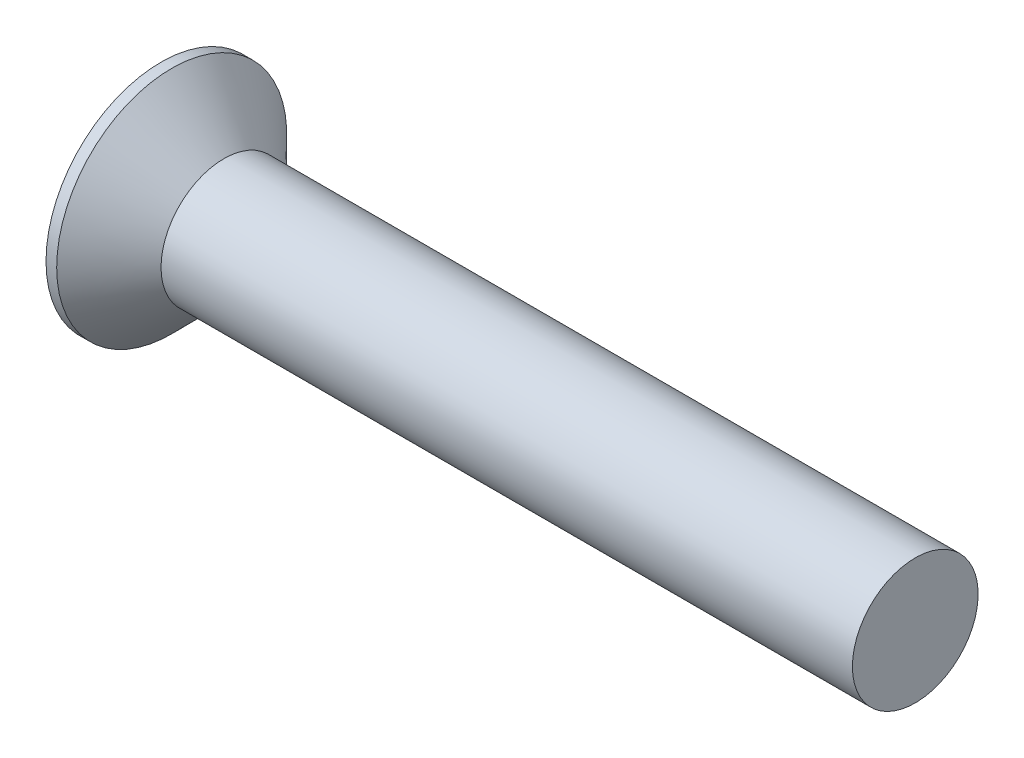
ISO-10303-21;
HEADER;
FILE_DESCRIPTION(('STEP AP214'),'2;1');
FILE_NAME('part.step','',(''),(''),'','','');
FILE_SCHEMA(('AUTOMOTIVE_DESIGN { 1 0 10303 214 1 1 1 1 }'));
ENDSEC;
DATA;
#1=APPLICATION_CONTEXT('core data for automotive mechanical design processes');
#2=APPLICATION_PROTOCOL_DEFINITION('international standard','automotive_design',2000,#1);
#3=PRODUCT_CONTEXT('',#1,'mechanical');
#4=PRODUCT('Part','Part','',(#3));
#5=PRODUCT_RELATED_PRODUCT_CATEGORY('part','',(#4));
#6=PRODUCT_DEFINITION_FORMATION('','',#4);
#7=PRODUCT_DEFINITION_CONTEXT('part definition',#1,'design');
#8=PRODUCT_DEFINITION('design','',#6,#7);
#9=PRODUCT_DEFINITION_SHAPE('','',#8);
#10=(LENGTH_UNIT() NAMED_UNIT(*) SI_UNIT(.MILLI.,.METRE.));
#11=(NAMED_UNIT(*) PLANE_ANGLE_UNIT() SI_UNIT($,.RADIAN.));
#12=(NAMED_UNIT(*) SI_UNIT($,.STERADIAN.) SOLID_ANGLE_UNIT());
#13=UNCERTAINTY_MEASURE_WITH_UNIT(LENGTH_MEASURE(1.E-05),#10,'distance_accuracy_value','');
#14=(GEOMETRIC_REPRESENTATION_CONTEXT(3) GLOBAL_UNCERTAINTY_ASSIGNED_CONTEXT((#13)) GLOBAL_UNIT_ASSIGNED_CONTEXT((#10,
#11,#12)) REPRESENTATION_CONTEXT('',''));
#15=CARTESIAN_POINT('',(0.,0.,0.));
#16=DIRECTION('',(0.,0.,1.));
#17=DIRECTION('',(1.,0.,0.));
#18=AXIS2_PLACEMENT_3D('',#15,#16,#17);
#19=CARTESIAN_POINT('',(0.,0.,0.));
#20=DIRECTION('',(-1.,0.,0.));
#21=DIRECTION('',(0.,0.,1.));
#22=AXIS2_PLACEMENT_3D('',#19,#20,#21);
#23=PLANE('',#22);
#24=CARTESIAN_POINT('',(0.,0.,0.));
#25=DIRECTION('',(-1.,0.,0.));
#26=DIRECTION('',(0.,0.,1.));
#27=AXIS2_PLACEMENT_3D('',#24,#25,#26);
#28=CIRCLE('',#27,9.15);
#29=CARTESIAN_POINT('',(0.,0.,9.15));
#30=VERTEX_POINT('',#29);
#31=EDGE_CURVE('E44',#30,#30,#28,.T.);
#32=ORIENTED_EDGE('',*,*,#31,.T.);
#33=EDGE_LOOP('',(#32));
#34=FACE_BOUND('',#33,.T.);
#35=DIRECTION('',(0.,1.,0.));
#36=VECTOR('',#35,1.);
#37=CARTESIAN_POINT('',(0.,-4.94,-0.99));
#38=LINE('',#37,#36);
#39=CARTESIAN_POINT('',(0.,-4.94,-0.99));
#40=VERTEX_POINT('',#39);
#41=CARTESIAN_POINT('',(0.,-0.989999999999997,-0.989999999999999));
#42=VERTEX_POINT('',#41);
#43=EDGE_CURVE('E105',#40,#42,#38,.T.);
#44=ORIENTED_EDGE('',*,*,#43,.T.);
#45=DIRECTION('',(0.,0.,-1.));
#46=VECTOR('',#45,1.);
#47=CARTESIAN_POINT('',(0.,-0.990000000000017,4.94));
#48=LINE('',#47,#46);
#49=CARTESIAN_POINT('',(0.,-0.989999999999984,-4.94));
#50=VERTEX_POINT('',#49);
#51=EDGE_CURVE('E85',#42,#50,#48,.T.);
#52=ORIENTED_EDGE('',*,*,#51,.T.);
#53=DIRECTION('',(0.,1.,0.));
#54=VECTOR('',#53,1.);
#55=CARTESIAN_POINT('',(0.,-0.989999999999984,-4.94));
#56=LINE('',#55,#54);
#57=CARTESIAN_POINT('',(0.,0.990000000000017,-4.94));
#58=VERTEX_POINT('',#57);
#59=EDGE_CURVE('E344',#50,#58,#56,.T.);
#60=ORIENTED_EDGE('',*,*,#59,.T.);
#61=DIRECTION('',(0.,0.,1.));
#62=VECTOR('',#61,1.);
#63=CARTESIAN_POINT('',(0.,0.990000000000017,-4.94));
#64=LINE('',#63,#62);
#65=CARTESIAN_POINT('',(0.,0.990000000000003,-0.990000000000001));
#66=VERTEX_POINT('',#65);
#67=EDGE_CURVE('E101',#58,#66,#64,.T.);
#68=ORIENTED_EDGE('',*,*,#67,.T.);
#69=CARTESIAN_POINT('',(0.,4.94,-0.99));
#70=VERTEX_POINT('',#69);
#71=EDGE_CURVE('E95',#66,#70,#38,.T.);
#72=ORIENTED_EDGE('',*,*,#71,.T.);
#73=DIRECTION('',(0.,0.,1.));
#74=VECTOR('',#73,1.);
#75=CARTESIAN_POINT('',(0.,4.94,-0.99));
#76=LINE('',#75,#74);
#77=CARTESIAN_POINT('',(0.,4.94,0.99));
#78=VERTEX_POINT('',#77);
#79=EDGE_CURVE('E98',#70,#78,#76,.T.);
#80=ORIENTED_EDGE('',*,*,#79,.T.);
#81=DIRECTION('',(0.,-1.,0.));
#82=VECTOR('',#81,1.);
#83=CARTESIAN_POINT('',(0.,4.94,0.99));
#84=LINE('',#83,#82);
#85=CARTESIAN_POINT('',(0.,0.989999999999997,0.99));
#86=VERTEX_POINT('',#85);
#87=EDGE_CURVE('E356',#78,#86,#84,.T.);
#88=ORIENTED_EDGE('',*,*,#87,.T.);
#89=CARTESIAN_POINT('',(0.,0.989999999999983,4.94));
#90=VERTEX_POINT('',#89);
#91=EDGE_CURVE('E339',#86,#90,#64,.T.);
#92=ORIENTED_EDGE('',*,*,#91,.T.);
#93=DIRECTION('',(0.,-1.,0.));
#94=VECTOR('',#93,1.);
#95=CARTESIAN_POINT('',(0.,0.989999999999983,4.94));
#96=LINE('',#95,#94);
#97=CARTESIAN_POINT('',(0.,-0.990000000000017,4.94));
#98=VERTEX_POINT('',#97);
#99=EDGE_CURVE('E325',#90,#98,#96,.T.);
#100=ORIENTED_EDGE('',*,*,#99,.T.);
#101=CARTESIAN_POINT('',(0.,-0.990000000000004,0.990000000000001));
#102=VERTEX_POINT('',#101);
#103=EDGE_CURVE('E337',#98,#102,#48,.T.);
#104=ORIENTED_EDGE('',*,*,#103,.T.);
#105=CARTESIAN_POINT('',(0.,-4.94,0.990000000000001));
#106=VERTEX_POINT('',#105);
#107=EDGE_CURVE('E111',#102,#106,#84,.T.);
#108=ORIENTED_EDGE('',*,*,#107,.T.);
#109=DIRECTION('',(0.,0.,-1.));
#110=VECTOR('',#109,1.);
#111=CARTESIAN_POINT('',(0.,-4.94,0.990000000000001));
#112=LINE('',#111,#110);
#113=EDGE_CURVE('E134',#106,#40,#112,.T.);
#114=ORIENTED_EDGE('',*,*,#113,.T.);
#115=EDGE_LOOP('',(#44,#52,#60,#68,#72,#80,#88,#92,#100,#104,#108,#114));
#116=FACE_BOUND('',#115,.T.);
#117=ADVANCED_FACE('F37',(#34,#116),#23,.T.);
#118=CARTESIAN_POINT('',(6.6459392575928,0.,0.439876265466817));
#119=DIRECTION('',(-0.0824937845566325,0.,-0.996591579088206));
#120=DIRECTION('',(-0.996591579088206,0.,0.0824937845566325));
#121=AXIS2_PLACEMENT_3D('',#118,#119,#120);
#122=PLANE('',#121);
#123=ORIENTED_EDGE('',*,*,#107,.F.);
#124=DIRECTION('',(0.993217774269884,0.0822145147597984,-0.0822145147597981));
#125=VECTOR('',#124,1.);
#126=CARTESIAN_POINT('',(6.68185819745171,-0.436903042184183,0.436903042184182));
#127=LINE('',#126,#125);
#128=CARTESIAN_POINT('',(5.98,-0.495000000000002,0.494999999999998));
#129=VERTEX_POINT('',#128);
#130=EDGE_CURVE('E129',#102,#129,#127,.T.);
#131=ORIENTED_EDGE('',*,*,#130,.T.);
#132=DIRECTION('',(0.800804244667336,0.595246633368948,-0.0662873078779819));
#133=VECTOR('',#132,1.);
#134=CARTESIAN_POINT('',(0.,-4.94,0.990000000000001));
#135=LINE('',#134,#133);
#136=EDGE_CURVE('E106',#106,#129,#135,.T.);
#137=ORIENTED_EDGE('',*,*,#136,.F.);
#138=EDGE_LOOP('',(#123,#131,#137));
#139=FACE_BOUND('',#138,.T.);
#140=ADVANCED_FACE('F157',(#139),#122,.T.);
#141=DIRECTION('',(0.800804244667336,-0.595246633368948,-0.0662873078779818));
#142=VECTOR('',#141,1.);
#143=CARTESIAN_POINT('',(0.,4.94,0.99));
#144=LINE('',#143,#142);
#145=CARTESIAN_POINT('',(5.98,0.495,0.495));
#146=VERTEX_POINT('',#145);
#147=EDGE_CURVE('E51',#78,#146,#144,.T.);
#148=ORIENTED_EDGE('',*,*,#147,.T.);
#149=DIRECTION('',(-0.993217774269884,0.0822145147597978,0.0822145147597981));
#150=VECTOR('',#149,1.);
#151=CARTESIAN_POINT('',(6.68185819745171,0.43690304218418,0.436903042184181));
#152=LINE('',#151,#150);
#153=EDGE_CURVE('E352',#146,#86,#152,.T.);
#154=ORIENTED_EDGE('',*,*,#153,.T.);
#155=ORIENTED_EDGE('',*,*,#87,.F.);
#156=EDGE_LOOP('',(#148,#154,#155));
#157=FACE_BOUND('',#156,.T.);
#158=ADVANCED_FACE('F161',(#157),#122,.T.);
#159=CARTESIAN_POINT('',(6.6459392575928,0.,-0.439876265466817));
#160=DIRECTION('',(-0.0824937845566324,0.,0.996591579088206));
#161=DIRECTION('',(0.996591579088206,0.,0.0824937845566324));
#162=AXIS2_PLACEMENT_3D('',#159,#160,#161);
#163=PLANE('',#162);
#164=DIRECTION('',(0.800804244667336,0.595246633368948,0.0662873078779818));
#165=VECTOR('',#164,1.);
#166=CARTESIAN_POINT('',(0.,-4.94,-0.99));
#167=LINE('',#166,#165);
#168=CARTESIAN_POINT('',(5.98,-0.494999999999998,-0.495000000000002));
#169=VERTEX_POINT('',#168);
#170=EDGE_CURVE('E60',#40,#169,#167,.T.);
#171=ORIENTED_EDGE('',*,*,#170,.T.);
#172=DIRECTION('',(-0.993217774269884,-0.0822145147597979,-0.0822145147597981));
#173=VECTOR('',#172,1.);
#174=CARTESIAN_POINT('',(6.68185819745171,-0.43690304218418,-0.436903042184181));
#175=LINE('',#174,#173);
#176=EDGE_CURVE('E11',#169,#42,#175,.T.);
#177=ORIENTED_EDGE('',*,*,#176,.T.);
#178=ORIENTED_EDGE('',*,*,#43,.F.);
#179=EDGE_LOOP('',(#171,#177,#178));
#180=FACE_BOUND('',#179,.T.);
#181=ADVANCED_FACE('F154',(#180),#163,.T.);
#182=ORIENTED_EDGE('',*,*,#71,.F.);
#183=DIRECTION('',(0.993217774269884,-0.0822145147597984,0.0822145147597981));
#184=VECTOR('',#183,1.);
#185=CARTESIAN_POINT('',(6.68185819745171,0.436903042184183,-0.436903042184181));
#186=LINE('',#185,#184);
#187=CARTESIAN_POINT('',(5.98,0.495,-0.495));
#188=VERTEX_POINT('',#187);
#189=EDGE_CURVE('E114',#66,#188,#186,.T.);
#190=ORIENTED_EDGE('',*,*,#189,.T.);
#191=DIRECTION('',(0.800804244667336,-0.595246633368948,0.0662873078779818));
#192=VECTOR('',#191,1.);
#193=CARTESIAN_POINT('',(0.,4.94,-0.99));
#194=LINE('',#193,#192);
#195=EDGE_CURVE('E110',#70,#188,#194,.T.);
#196=ORIENTED_EDGE('',*,*,#195,.F.);
#197=EDGE_LOOP('',(#182,#190,#196));
#198=FACE_BOUND('',#197,.T.);
#199=ADVANCED_FACE('F113',(#198),#163,.T.);
#200=CARTESIAN_POINT('',(-6.34999999999999,0.,0.));
#201=DIRECTION('',(-1.,0.,0.));
#202=DIRECTION('',(0.,0.,1.));
#203=AXIS2_PLACEMENT_3D('',#200,#201,#202);
#204=CYLINDRICAL_SURFACE('',#203,9.15);
#205=CARTESIAN_POINT('',(0.850000000000017,0.,0.));
#206=DIRECTION('',(-1.,0.,0.));
#207=DIRECTION('',(0.,0.,1.));
#208=AXIS2_PLACEMENT_3D('',#205,#206,#207);
#209=CIRCLE('',#208,9.15);
#210=CARTESIAN_POINT('',(0.850000000000017,0.,9.15));
#211=VERTEX_POINT('',#210);
#212=EDGE_CURVE('E137',#211,#211,#209,.T.);
#213=ORIENTED_EDGE('',*,*,#212,.T.);
#214=EDGE_LOOP('',(#213));
#215=FACE_BOUND('',#214,.T.);
#216=ORIENTED_EDGE('',*,*,#31,.F.);
#217=EDGE_LOOP('',(#216));
#218=FACE_BOUND('',#217,.T.);
#219=ADVANCED_FACE('F143',(#215,#218),#204,.T.);
#220=CARTESIAN_POINT('',(0.850000000000017,0.,0.));
#221=DIRECTION('',(-1.,0.,0.));
#222=DIRECTION('',(0.,0.,1.));
#223=AXIS2_PLACEMENT_3D('',#220,#221,#222);
#224=CONICAL_SURFACE('',#223,9.15,0.78539816339745);
#225=CARTESIAN_POINT('',(5.,0.,0.));
#226=DIRECTION('',(-1.,0.,0.));
#227=DIRECTION('',(0.,0.,1.));
#228=AXIS2_PLACEMENT_3D('',#225,#226,#227);
#229=CIRCLE('',#228,5.);
#230=CARTESIAN_POINT('',(5.,0.,5.));
#231=VERTEX_POINT('',#230);
#232=EDGE_CURVE('E133',#231,#231,#229,.T.);
#233=ORIENTED_EDGE('',*,*,#232,.T.);
#234=EDGE_LOOP('',(#233));
#235=FACE_BOUND('',#234,.T.);
#236=ORIENTED_EDGE('',*,*,#212,.F.);
#237=EDGE_LOOP('',(#236));
#238=FACE_BOUND('',#237,.T.);
#239=ADVANCED_FACE('F145',(#235,#238),#224,.T.);
#240=CARTESIAN_POINT('',(-6.34999999999999,0.,0.));
#241=DIRECTION('',(-1.,0.,0.));
#242=DIRECTION('',(0.,0.,1.));
#243=AXIS2_PLACEMENT_3D('',#240,#241,#242);
#244=CYLINDRICAL_SURFACE('',#243,5.);
#245=CARTESIAN_POINT('',(60.,0.,0.));
#246=DIRECTION('',(-1.,0.,0.));
#247=DIRECTION('',(0.,0.,1.));
#248=AXIS2_PLACEMENT_3D('',#245,#246,#247);
#249=CIRCLE('',#248,5.);
#250=CARTESIAN_POINT('',(60.,0.,5.));
#251=VERTEX_POINT('',#250);
#252=EDGE_CURVE('E130',#251,#251,#249,.T.);
#253=ORIENTED_EDGE('',*,*,#252,.T.);
#254=EDGE_LOOP('',(#253));
#255=FACE_BOUND('',#254,.T.);
#256=ORIENTED_EDGE('',*,*,#232,.F.);
#257=EDGE_LOOP('',(#256));
#258=FACE_BOUND('',#257,.T.);
#259=ADVANCED_FACE('F151',(#255,#258),#244,.T.);
#260=CARTESIAN_POINT('',(60.,5.,0.));
#261=DIRECTION('',(1.,0.,0.));
#262=DIRECTION('',(0.,0.,-1.));
#263=AXIS2_PLACEMENT_3D('',#260,#261,#262);
#264=PLANE('',#263);
#265=ORIENTED_EDGE('',*,*,#252,.F.);
#266=EDGE_LOOP('',(#265));
#267=FACE_BOUND('',#266,.T.);
#268=ADVANCED_FACE('F181',(#267),#264,.T.);
#269=CARTESIAN_POINT('',(5.98,0.495,-0.495));
#270=DIRECTION('',(1.,0.,0.));
#271=DIRECTION('',(0.,0.,-1.));
#272=AXIS2_PLACEMENT_3D('',#269,#270,#271);
#273=PLANE('',#272);
#274=DIRECTION('',(0.,1.,0.));
#275=VECTOR('',#274,1.);
#276=CARTESIAN_POINT('',(5.98,-0.495,-0.495));
#277=LINE('',#276,#275);
#278=EDGE_CURVE('E125',#169,#188,#277,.T.);
#279=ORIENTED_EDGE('',*,*,#278,.F.);
#280=DIRECTION('',(0.,0.,-1.));
#281=VECTOR('',#280,1.);
#282=CARTESIAN_POINT('',(5.98,-0.495,0.495));
#283=LINE('',#282,#281);
#284=EDGE_CURVE('E116',#129,#169,#283,.T.);
#285=ORIENTED_EDGE('',*,*,#284,.F.);
#286=DIRECTION('',(0.,-1.,0.));
#287=VECTOR('',#286,1.);
#288=CARTESIAN_POINT('',(5.98,0.495,0.495));
#289=LINE('',#288,#287);
#290=EDGE_CURVE('E119',#146,#129,#289,.T.);
#291=ORIENTED_EDGE('',*,*,#290,.F.);
#292=DIRECTION('',(0.,0.,1.));
#293=VECTOR('',#292,1.);
#294=CARTESIAN_POINT('',(5.98,0.495,-0.495));
#295=LINE('',#294,#293);
#296=EDGE_CURVE('E123',#188,#146,#295,.T.);
#297=ORIENTED_EDGE('',*,*,#296,.F.);
#298=EDGE_LOOP('',(#279,#285,#291,#297));
#299=FACE_BOUND('',#298,.T.);
#300=ADVANCED_FACE('F178',(#299),#273,.F.);
#301=CARTESIAN_POINT('',(0.,-4.94,-0.99));
#302=DIRECTION('',(-0.596558717929624,0.802569433795085,0.));
#303=DIRECTION('',(-0.802569433795085,-0.596558717929624,0.));
#304=AXIS2_PLACEMENT_3D('',#301,#302,#303);
#305=PLANE('',#304);
#306=ORIENTED_EDGE('',*,*,#170,.F.);
#307=ORIENTED_EDGE('',*,*,#113,.F.);
#308=ORIENTED_EDGE('',*,*,#136,.T.);
#309=ORIENTED_EDGE('',*,*,#284,.T.);
#310=EDGE_LOOP('',(#306,#307,#308,#309));
#311=FACE_BOUND('',#310,.T.);
#312=ADVANCED_FACE('F170',(#311),#305,.T.);
#313=CARTESIAN_POINT('',(5.98,0.495,0.495));
#314=DIRECTION('',(-0.596558717929624,-0.802569433795085,0.));
#315=DIRECTION('',(0.802569433795085,-0.596558717929624,0.));
#316=AXIS2_PLACEMENT_3D('',#313,#314,#315);
#317=PLANE('',#316);
#318=ORIENTED_EDGE('',*,*,#147,.F.);
#319=ORIENTED_EDGE('',*,*,#79,.F.);
#320=ORIENTED_EDGE('',*,*,#195,.T.);
#321=ORIENTED_EDGE('',*,*,#296,.T.);
#322=EDGE_LOOP('',(#318,#319,#320,#321));
#323=FACE_BOUND('',#322,.T.);
#324=ADVANCED_FACE('F109',(#323),#317,.T.);
#325=CARTESIAN_POINT('',(6.6459392575928,-0.439876265466817,0.));
#326=DIRECTION('',(-0.0824937845566325,0.996591579088206,0.));
#327=DIRECTION('',(-0.996591579088206,-0.0824937845566325,0.));
#328=AXIS2_PLACEMENT_3D('',#325,#326,#327);
#329=PLANE('',#328);
#330=DIRECTION('',(0.800804244667336,0.0662873078779799,0.595246633368948));
#331=VECTOR('',#330,1.);
#332=CARTESIAN_POINT('',(0.,-0.989999999999984,-4.94));
#333=LINE('',#332,#331);
#334=EDGE_CURVE('E346',#50,#169,#333,.T.);
#335=ORIENTED_EDGE('',*,*,#334,.F.);
#336=ORIENTED_EDGE('',*,*,#51,.F.);
#337=ORIENTED_EDGE('',*,*,#176,.F.);
#338=EDGE_LOOP('',(#335,#336,#337));
#339=FACE_BOUND('',#338,.T.);
#340=ADVANCED_FACE('F177',(#339),#329,.T.);
#341=CARTESIAN_POINT('',(6.6459392575928,0.439876265466817,0.));
#342=DIRECTION('',(-0.0824937845566324,-0.996591579088206,0.));
#343=DIRECTION('',(0.996591579088206,-0.0824937845566324,0.));
#344=AXIS2_PLACEMENT_3D('',#341,#342,#343);
#345=PLANE('',#344);
#346=ORIENTED_EDGE('',*,*,#67,.F.);
#347=DIRECTION('',(0.800804244667336,-0.0662873078779839,0.595246633368948));
#348=VECTOR('',#347,1.);
#349=CARTESIAN_POINT('',(0.,0.990000000000017,-4.94));
#350=LINE('',#349,#348);
#351=EDGE_CURVE('E76',#58,#188,#350,.T.);
#352=ORIENTED_EDGE('',*,*,#351,.T.);
#353=ORIENTED_EDGE('',*,*,#189,.F.);
#354=EDGE_LOOP('',(#346,#352,#353));
#355=FACE_BOUND('',#354,.T.);
#356=ADVANCED_FACE('F222',(#355),#345,.T.);
#357=CARTESIAN_POINT('',(0.,0.990000000000017,-4.94));
#358=DIRECTION('',(-0.596558717929624,0.,0.802569433795085));
#359=DIRECTION('',(-0.802569433795085,0.,-0.596558717929624));
#360=AXIS2_PLACEMENT_3D('',#357,#358,#359);
#361=PLANE('',#360);
#362=ORIENTED_EDGE('',*,*,#351,.F.);
#363=ORIENTED_EDGE('',*,*,#59,.F.);
#364=ORIENTED_EDGE('',*,*,#334,.T.);
#365=ORIENTED_EDGE('',*,*,#278,.T.);
#366=EDGE_LOOP('',(#362,#363,#364,#365));
#367=FACE_BOUND('',#366,.T.);
#368=ADVANCED_FACE('F230',(#367),#361,.T.);
#369=ORIENTED_EDGE('',*,*,#103,.F.);
#370=DIRECTION('',(0.800804244667336,0.0662873078779839,-0.595246633368948));
#371=VECTOR('',#370,1.);
#372=CARTESIAN_POINT('',(0.,-0.990000000000017,4.94));
#373=LINE('',#372,#371);
#374=EDGE_CURVE('E322',#98,#129,#373,.T.);
#375=ORIENTED_EDGE('',*,*,#374,.T.);
#376=ORIENTED_EDGE('',*,*,#130,.F.);
#377=EDGE_LOOP('',(#369,#375,#376));
#378=FACE_BOUND('',#377,.T.);
#379=ADVANCED_FACE('F224',(#378),#329,.T.);
#380=DIRECTION('',(0.800804244667336,-0.0662873078779797,-0.595246633368948));
#381=VECTOR('',#380,1.);
#382=CARTESIAN_POINT('',(0.,0.989999999999983,4.94));
#383=LINE('',#382,#381);
#384=EDGE_CURVE('E333',#90,#146,#383,.T.);
#385=ORIENTED_EDGE('',*,*,#384,.F.);
#386=ORIENTED_EDGE('',*,*,#91,.F.);
#387=ORIENTED_EDGE('',*,*,#153,.F.);
#388=EDGE_LOOP('',(#385,#386,#387));
#389=FACE_BOUND('',#388,.T.);
#390=ADVANCED_FACE('F232',(#389),#345,.T.);
#391=CARTESIAN_POINT('',(5.98,-0.495000000000002,0.494999999999998));
#392=DIRECTION('',(-0.596558717929624,0.,-0.802569433795085));
#393=DIRECTION('',(0.802569433795085,0.,-0.596558717929624));
#394=AXIS2_PLACEMENT_3D('',#391,#392,#393);
#395=PLANE('',#394);
#396=ORIENTED_EDGE('',*,*,#374,.F.);
#397=ORIENTED_EDGE('',*,*,#99,.F.);
#398=ORIENTED_EDGE('',*,*,#384,.T.);
#399=ORIENTED_EDGE('',*,*,#290,.T.);
#400=EDGE_LOOP('',(#396,#397,#398,#399));
#401=FACE_BOUND('',#400,.T.);
#402=ADVANCED_FACE('F251',(#401),#395,.T.);
#403=CLOSED_SHELL('',(#117,#140,#158,#181,#199,#219,#239,#259,#268,#300,#312,#324,#340,#356,
#368,#379,#390,#402));
#404=MANIFOLD_SOLID_BREP('B2',#403);
#405=ADVANCED_BREP_SHAPE_REPRESENTATION('',(#18,#404),#14);
#406=SHAPE_DEFINITION_REPRESENTATION(#9,#405);
ENDSEC;
END-ISO-10303-21;
